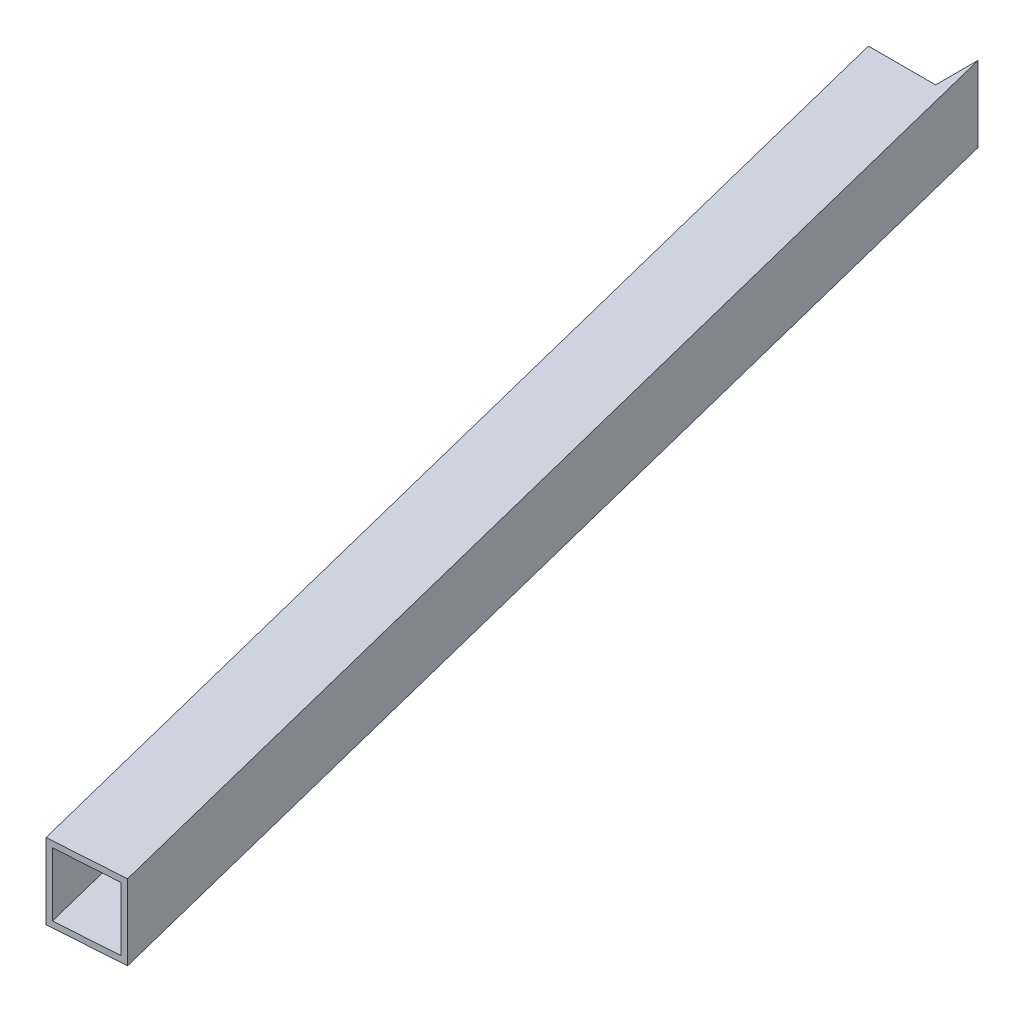
ISO-10303-21;
HEADER;
FILE_DESCRIPTION(('STEP AP214'),'2;1');
FILE_NAME('part.step','',(''),(''),'','','');
FILE_SCHEMA(('AUTOMOTIVE_DESIGN { 1 0 10303 214 1 1 1 1 }'));
ENDSEC;
DATA;
#1=APPLICATION_CONTEXT('core data for automotive mechanical design processes');
#2=APPLICATION_PROTOCOL_DEFINITION('international standard','automotive_design',2000,#1);
#3=PRODUCT_CONTEXT('',#1,'mechanical');
#4=PRODUCT('Part','Part','',(#3));
#5=PRODUCT_RELATED_PRODUCT_CATEGORY('part','',(#4));
#6=PRODUCT_DEFINITION_FORMATION('','',#4);
#7=PRODUCT_DEFINITION_CONTEXT('part definition',#1,'design');
#8=PRODUCT_DEFINITION('design','',#6,#7);
#9=PRODUCT_DEFINITION_SHAPE('','',#8);
#10=(LENGTH_UNIT() NAMED_UNIT(*) SI_UNIT(.MILLI.,.METRE.));
#11=(NAMED_UNIT(*) PLANE_ANGLE_UNIT() SI_UNIT($,.RADIAN.));
#12=(NAMED_UNIT(*) SI_UNIT($,.STERADIAN.) SOLID_ANGLE_UNIT());
#13=UNCERTAINTY_MEASURE_WITH_UNIT(LENGTH_MEASURE(1.E-05),#10,'distance_accuracy_value','');
#14=(GEOMETRIC_REPRESENTATION_CONTEXT(3) GLOBAL_UNCERTAINTY_ASSIGNED_CONTEXT((#13)) GLOBAL_UNIT_ASSIGNED_CONTEXT((#10,
#11,#12)) REPRESENTATION_CONTEXT('',''));
#15=CARTESIAN_POINT('',(0.,0.,0.));
#16=DIRECTION('',(0.,0.,1.));
#17=DIRECTION('',(1.,0.,0.));
#18=AXIS2_PLACEMENT_3D('',#15,#16,#17);
#19=CARTESIAN_POINT('',(184.701425001453,10.,-2002.42535625036));
#20=DIRECTION('',(0.,-1.,0.));
#21=DIRECTION('',(0.,0.,-1.));
#22=AXIS2_PLACEMENT_3D('',#19,#20,#21);
#23=PLANE('',#22);
#24=DIRECTION('',(0.,0.,1.));
#25=VECTOR('',#24,1.);
#26=CARTESIAN_POINT('',(185.,10.,-2300.));
#27=LINE('',#26,#25);
#28=CARTESIAN_POINT('',(185.,10.,-2001.23105625618));
#29=VERTEX_POINT('',#28);
#30=CARTESIAN_POINT('',(185.,10.,-1990.));
#31=VERTEX_POINT('',#30);
#32=EDGE_CURVE('E119',#29,#31,#27,.T.);
#33=ORIENTED_EDGE('',*,*,#32,.T.);
#34=DIRECTION('',(-1.,0.,0.));
#35=VECTOR('',#34,1.);
#36=CARTESIAN_POINT('',(175.,10.,-1990.));
#37=LINE('',#36,#35);
#38=CARTESIAN_POINT('',(167.192235935956,10.,-1990.));
#39=VERTEX_POINT('',#38);
#40=EDGE_CURVE('E126',#31,#39,#37,.T.);
#41=ORIENTED_EDGE('',*,*,#40,.T.);
#42=DIRECTION('',(0.242535625036333,0.,0.970142500145332));
#43=VECTOR('',#42,1.);
#44=CARTESIAN_POINT('',(165.298574998547,10.,-1997.57464374964));
#45=LINE('',#44,#43);
#46=CARTESIAN_POINT('',(239.858774037238,10.,-1699.33384759487));
#47=VERTEX_POINT('',#46);
#48=EDGE_CURVE('E171',#39,#47,#45,.T.);
#49=ORIENTED_EDGE('',*,*,#48,.T.);
#50=DIRECTION('',(-0.997849528858152,0.,0.0655463023942972));
#51=VECTOR('',#50,1.);
#52=CARTESIAN_POINT('',(204.762203784589,10.,-1697.02843947446));
#53=LINE('',#52,#51);
#54=CARTESIAN_POINT('',(260.141225962762,10.,-1700.66615240513));
#55=VERTEX_POINT('',#54);
#56=EDGE_CURVE('E168',#55,#47,#53,.T.);
#57=ORIENTED_EDGE('',*,*,#56,.F.);
#58=DIRECTION('',(0.242535625036333,0.,0.970142500145332));
#59=VECTOR('',#58,1.);
#60=CARTESIAN_POINT('',(184.701425001453,10.,-2002.42535625036));
#61=LINE('',#60,#59);
#62=EDGE_CURVE('E134',#29,#55,#61,.T.);
#63=ORIENTED_EDGE('',*,*,#62,.F.);
#64=EDGE_LOOP('',(#33,#41,#49,#57,#63));
#65=FACE_BOUND('',#64,.T.);
#66=ADVANCED_FACE('F41',(#65),#23,.F.);
#67=CARTESIAN_POINT('',(184.701425001453,10.,-2002.42535625036));
#68=DIRECTION('',(-0.970142500145332,0.,0.242535625036333));
#69=DIRECTION('',(0.242535625036333,0.,0.970142500145332));
#70=AXIS2_PLACEMENT_3D('',#67,#68,#69);
#71=PLANE('',#70);
#72=DIRECTION('',(0.,-1.,0.));
#73=VECTOR('',#72,1.);
#74=CARTESIAN_POINT('',(185.,10.,-2001.23105625618));
#75=LINE('',#74,#73);
#76=CARTESIAN_POINT('',(185.,-10.,-2001.23105625618));
#77=VERTEX_POINT('',#76);
#78=EDGE_CURVE('E148',#29,#77,#75,.T.);
#79=ORIENTED_EDGE('',*,*,#78,.F.);
#80=ORIENTED_EDGE('',*,*,#62,.T.);
#81=DIRECTION('',(0.,1.,0.));
#82=VECTOR('',#81,1.);
#83=CARTESIAN_POINT('',(260.141225962762,10.,-1700.66615240513));
#84=LINE('',#83,#82);
#85=CARTESIAN_POINT('',(260.141225962762,-10.,-1700.66615240513));
#86=VERTEX_POINT('',#85);
#87=EDGE_CURVE('E165',#86,#55,#84,.T.);
#88=ORIENTED_EDGE('',*,*,#87,.F.);
#89=DIRECTION('',(0.242535625036333,0.,0.970142500145332));
#90=VECTOR('',#89,1.);
#91=CARTESIAN_POINT('',(184.701425001453,-10.,-2002.42535625036));
#92=LINE('',#91,#90);
#93=EDGE_CURVE('E184',#77,#86,#92,.T.);
#94=ORIENTED_EDGE('',*,*,#93,.F.);
#95=EDGE_LOOP('',(#79,#80,#88,#94));
#96=FACE_BOUND('',#95,.T.);
#97=ADVANCED_FACE('F218',(#96),#71,.F.);
#98=CARTESIAN_POINT('',(184.701425001453,-10.,-2002.42535625036));
#99=DIRECTION('',(0.,1.,0.));
#100=DIRECTION('',(0.,0.,1.));
#101=AXIS2_PLACEMENT_3D('',#98,#99,#100);
#102=PLANE('',#101);
#103=DIRECTION('',(0.,0.,1.));
#104=VECTOR('',#103,1.);
#105=CARTESIAN_POINT('',(185.,-10.,-2300.));
#106=LINE('',#105,#104);
#107=CARTESIAN_POINT('',(185.,-10.,-1990.));
#108=VERTEX_POINT('',#107);
#109=EDGE_CURVE('E124',#77,#108,#106,.T.);
#110=ORIENTED_EDGE('',*,*,#109,.F.);
#111=ORIENTED_EDGE('',*,*,#93,.T.);
#112=DIRECTION('',(0.997849528858152,0.,-0.0655463023942972));
#113=VECTOR('',#112,1.);
#114=CARTESIAN_POINT('',(204.762203784589,-10.,-1697.02843947446));
#115=LINE('',#114,#113);
#116=CARTESIAN_POINT('',(239.858774037238,-10.,-1699.33384759487));
#117=VERTEX_POINT('',#116);
#118=EDGE_CURVE('E162',#117,#86,#115,.T.);
#119=ORIENTED_EDGE('',*,*,#118,.F.);
#120=DIRECTION('',(0.242535625036333,0.,0.970142500145332));
#121=VECTOR('',#120,1.);
#122=CARTESIAN_POINT('',(165.298574998547,-10.,-1997.57464374964));
#123=LINE('',#122,#121);
#124=CARTESIAN_POINT('',(167.192235935956,-10.,-1990.));
#125=VERTEX_POINT('',#124);
#126=EDGE_CURVE('E182',#125,#117,#123,.T.);
#127=ORIENTED_EDGE('',*,*,#126,.F.);
#128=DIRECTION('',(-1.,0.,0.));
#129=VECTOR('',#128,1.);
#130=CARTESIAN_POINT('',(175.,-10.,-1990.));
#131=LINE('',#130,#129);
#132=EDGE_CURVE('E130',#108,#125,#131,.T.);
#133=ORIENTED_EDGE('',*,*,#132,.F.);
#134=EDGE_LOOP('',(#110,#111,#119,#127,#133));
#135=FACE_BOUND('',#134,.T.);
#136=ADVANCED_FACE('F213',(#135),#102,.F.);
#137=CARTESIAN_POINT('',(165.298574998547,10.,-1997.57464374964));
#138=DIRECTION('',(0.970142500145332,0.,-0.242535625036333));
#139=DIRECTION('',(-0.242535625036333,0.,-0.970142500145332));
#140=AXIS2_PLACEMENT_3D('',#137,#138,#139);
#141=PLANE('',#140);
#142=DIRECTION('',(0.,1.,0.));
#143=VECTOR('',#142,1.);
#144=CARTESIAN_POINT('',(167.192235935956,10.,-1990.));
#145=LINE('',#144,#143);
#146=EDGE_CURVE('E55',#125,#39,#145,.T.);
#147=ORIENTED_EDGE('',*,*,#146,.F.);
#148=ORIENTED_EDGE('',*,*,#126,.T.);
#149=DIRECTION('',(0.,-1.,0.));
#150=VECTOR('',#149,1.);
#151=CARTESIAN_POINT('',(239.858774037238,10.,-1699.33384759487));
#152=LINE('',#151,#150);
#153=EDGE_CURVE('E159',#47,#117,#152,.T.);
#154=ORIENTED_EDGE('',*,*,#153,.F.);
#155=ORIENTED_EDGE('',*,*,#48,.F.);
#156=EDGE_LOOP('',(#147,#148,#154,#155));
#157=FACE_BOUND('',#156,.T.);
#158=ADVANCED_FACE('F221',(#157),#141,.F.);
#159=CARTESIAN_POINT('',(250.,0.,-1700.));
#160=DIRECTION('',(0.0655463023942972,0.,0.997849528858152));
#161=DIRECTION('',(0.997849528858152,0.,-0.0655463023942972));
#162=AXIS2_PLACEMENT_3D('',#159,#160,#161);
#163=PLANE('',#162);
#164=DIRECTION('',(0.,-1.,0.));
#165=VECTOR('',#164,1.);
#166=CARTESIAN_POINT('',(241.48137019128,8.40000000000002,-1699.44043197969));
#167=LINE('',#166,#165);
#168=CARTESIAN_POINT('',(241.48137019128,8.40000000000002,-1699.44043197969));
#169=VERTEX_POINT('',#168);
#170=CARTESIAN_POINT('',(241.48137019128,-8.39999999999999,-1699.44043197969));
#171=VERTEX_POINT('',#170);
#172=EDGE_CURVE('E156',#169,#171,#167,.T.);
#173=ORIENTED_EDGE('',*,*,#172,.F.);
#174=DIRECTION('',(-0.997849528858152,0.,0.0655463023942972));
#175=VECTOR('',#174,1.);
#176=CARTESIAN_POINT('',(203.191263646348,8.40000000000008,-1696.92524824736));
#177=LINE('',#176,#175);
#178=CARTESIAN_POINT('',(258.51862980872,8.39999999999999,-1700.55956802031));
#179=VERTEX_POINT('',#178);
#180=EDGE_CURVE('E180',#179,#169,#177,.T.);
#181=ORIENTED_EDGE('',*,*,#180,.F.);
#182=DIRECTION('',(0.,1.,0.));
#183=VECTOR('',#182,1.);
#184=CARTESIAN_POINT('',(258.51862980872,8.39999999999999,-1700.55956802031));
#185=LINE('',#184,#183);
#186=CARTESIAN_POINT('',(258.51862980872,-8.39999999999999,-1700.55956802031));
#187=VERTEX_POINT('',#186);
#188=EDGE_CURVE('E150',#187,#179,#185,.T.);
#189=ORIENTED_EDGE('',*,*,#188,.F.);
#190=DIRECTION('',(0.997849528858152,0.,-0.0655463023942972));
#191=VECTOR('',#190,1.);
#192=CARTESIAN_POINT('',(203.191263646348,-8.39999999999999,-1696.92524824736));
#193=LINE('',#192,#191);
#194=EDGE_CURVE('E153',#171,#187,#193,.T.);
#195=ORIENTED_EDGE('',*,*,#194,.F.);
#196=EDGE_LOOP('',(#173,#181,#189,#195));
#197=FACE_BOUND('',#196,.T.);
#198=ORIENTED_EDGE('',*,*,#87,.T.);
#199=ORIENTED_EDGE('',*,*,#56,.T.);
#200=ORIENTED_EDGE('',*,*,#153,.T.);
#201=ORIENTED_EDGE('',*,*,#118,.T.);
#202=EDGE_LOOP('',(#198,#199,#200,#201));
#203=FACE_BOUND('',#202,.T.);
#204=ADVANCED_FACE('F199',(#197,#203),#163,.T.);
#205=CARTESIAN_POINT('',(166.850802998779,8.40000000000002,-1997.9627007497));
#206=DIRECTION('',(0.970142500145332,0.,-0.242535625036333));
#207=DIRECTION('',(-0.242535625036333,0.,-0.970142500145332));
#208=AXIS2_PLACEMENT_3D('',#205,#206,#207);
#209=PLANE('',#208);
#210=DIRECTION('',(0.242535625036333,0.,0.970142500145332));
#211=VECTOR('',#210,1.);
#212=CARTESIAN_POINT('',(166.850802998779,-8.39999999999999,-1997.9627007497));
#213=LINE('',#212,#211);
#214=CARTESIAN_POINT('',(168.841478186203,-8.39999999999999,-1990.));
#215=VERTEX_POINT('',#214);
#216=EDGE_CURVE('E178',#215,#171,#213,.T.);
#217=ORIENTED_EDGE('',*,*,#216,.F.);
#218=DIRECTION('',(0.,1.,0.));
#219=VECTOR('',#218,1.);
#220=CARTESIAN_POINT('',(168.841478186203,8.40000000000002,-1990.));
#221=LINE('',#220,#219);
#222=CARTESIAN_POINT('',(168.841478186203,8.40000000000002,-1990.));
#223=VERTEX_POINT('',#222);
#224=EDGE_CURVE('E48',#215,#223,#221,.T.);
#225=ORIENTED_EDGE('',*,*,#224,.T.);
#226=DIRECTION('',(0.242535625036333,0.,0.970142500145332));
#227=VECTOR('',#226,1.);
#228=CARTESIAN_POINT('',(166.850802998779,8.40000000000002,-1997.9627007497));
#229=LINE('',#228,#227);
#230=EDGE_CURVE('E172',#223,#169,#229,.T.);
#231=ORIENTED_EDGE('',*,*,#230,.T.);
#232=ORIENTED_EDGE('',*,*,#172,.T.);
#233=EDGE_LOOP('',(#217,#225,#231,#232));
#234=FACE_BOUND('',#233,.T.);
#235=ADVANCED_FACE('F191',(#234),#209,.T.);
#236=CARTESIAN_POINT('',(183.149197001221,-8.39999999999999,-2002.03729925031));
#237=DIRECTION('',(0.,1.,0.));
#238=DIRECTION('',(0.,0.,1.));
#239=AXIS2_PLACEMENT_3D('',#236,#237,#238);
#240=PLANE('',#239);
#241=DIRECTION('',(0.242535625036333,0.,0.970142500145332));
#242=VECTOR('',#241,1.);
#243=CARTESIAN_POINT('',(183.149197001221,-8.39999999999999,-2002.03729925031));
#244=LINE('',#243,#242);
#245=CARTESIAN_POINT('',(185.,-8.39999999999999,-1994.63408725519));
#246=VERTEX_POINT('',#245);
#247=EDGE_CURVE('E176',#246,#187,#244,.T.);
#248=ORIENTED_EDGE('',*,*,#247,.F.);
#249=DIRECTION('',(0.,0.,1.));
#250=VECTOR('',#249,1.);
#251=CARTESIAN_POINT('',(185.,-8.39999999999999,-2002.03729925031));
#252=LINE('',#251,#250);
#253=CARTESIAN_POINT('',(185.,-8.39999999999999,-1990.));
#254=VERTEX_POINT('',#253);
#255=EDGE_CURVE('E11',#246,#254,#252,.T.);
#256=ORIENTED_EDGE('',*,*,#255,.T.);
#257=DIRECTION('',(-1.,0.,0.));
#258=VECTOR('',#257,1.);
#259=CARTESIAN_POINT('',(183.149197001221,-8.39999999999999,-1990.));
#260=LINE('',#259,#258);
#261=EDGE_CURVE('E139',#254,#215,#260,.T.);
#262=ORIENTED_EDGE('',*,*,#261,.T.);
#263=ORIENTED_EDGE('',*,*,#216,.T.);
#264=ORIENTED_EDGE('',*,*,#194,.T.);
#265=EDGE_LOOP('',(#248,#256,#262,#263,#264));
#266=FACE_BOUND('',#265,.T.);
#267=ADVANCED_FACE('F206',(#266),#240,.T.);
#268=CARTESIAN_POINT('',(183.149197001221,8.39999999999999,-2002.03729925031));
#269=DIRECTION('',(-0.970142500145332,0.,0.242535625036333));
#270=DIRECTION('',(0.242535625036333,0.,0.970142500145332));
#271=AXIS2_PLACEMENT_3D('',#268,#269,#270);
#272=PLANE('',#271);
#273=DIRECTION('',(0.242535625036333,0.,0.970142500145332));
#274=VECTOR('',#273,1.);
#275=CARTESIAN_POINT('',(183.149197001221,8.39999999999999,-2002.03729925031));
#276=LINE('',#275,#274);
#277=CARTESIAN_POINT('',(185.,8.39999999999999,-1994.63408725519));
#278=VERTEX_POINT('',#277);
#279=EDGE_CURVE('E174',#278,#179,#276,.T.);
#280=ORIENTED_EDGE('',*,*,#279,.F.);
#281=DIRECTION('',(0.,-1.,0.));
#282=VECTOR('',#281,1.);
#283=CARTESIAN_POINT('',(185.,8.39999999999999,-1994.63408725519));
#284=LINE('',#283,#282);
#285=EDGE_CURVE('E144',#278,#246,#284,.T.);
#286=ORIENTED_EDGE('',*,*,#285,.T.);
#287=ORIENTED_EDGE('',*,*,#247,.T.);
#288=ORIENTED_EDGE('',*,*,#188,.T.);
#289=EDGE_LOOP('',(#280,#286,#287,#288));
#290=FACE_BOUND('',#289,.T.);
#291=ADVANCED_FACE('F203',(#290),#272,.T.);
#292=CARTESIAN_POINT('',(183.149197001221,8.39999999999999,-2002.03729925031));
#293=DIRECTION('',(0.,-1.,0.));
#294=DIRECTION('',(1.,0.,0.));
#295=AXIS2_PLACEMENT_3D('',#292,#293,#294);
#296=PLANE('',#295);
#297=DIRECTION('',(1.,0.,0.));
#298=VECTOR('',#297,1.);
#299=CARTESIAN_POINT('',(183.149197001221,8.4,-1990.));
#300=LINE('',#299,#298);
#301=CARTESIAN_POINT('',(185.,8.40000000000028,-1990.));
#302=VERTEX_POINT('',#301);
#303=EDGE_CURVE('E62',#223,#302,#300,.T.);
#304=ORIENTED_EDGE('',*,*,#303,.T.);
#305=DIRECTION('',(0.,0.,-1.));
#306=VECTOR('',#305,1.);
#307=CARTESIAN_POINT('',(185.,8.39999999999999,-2002.03729925031));
#308=LINE('',#307,#306);
#309=EDGE_CURVE('E122',#302,#278,#308,.T.);
#310=ORIENTED_EDGE('',*,*,#309,.T.);
#311=ORIENTED_EDGE('',*,*,#279,.T.);
#312=ORIENTED_EDGE('',*,*,#180,.T.);
#313=ORIENTED_EDGE('',*,*,#230,.F.);
#314=EDGE_LOOP('',(#304,#310,#311,#312,#313));
#315=FACE_BOUND('',#314,.T.);
#316=ADVANCED_FACE('F194',(#315),#296,.T.);
#317=CARTESIAN_POINT('',(175.,-10.,-1990.));
#318=DIRECTION('',(0.,0.,-1.));
#319=DIRECTION('',(-1.,0.,0.));
#320=AXIS2_PLACEMENT_3D('',#317,#318,#319);
#321=PLANE('',#320);
#322=ORIENTED_EDGE('',*,*,#146,.T.);
#323=ORIENTED_EDGE('',*,*,#40,.F.);
#324=DIRECTION('',(0.,1.,0.));
#325=VECTOR('',#324,1.);
#326=CARTESIAN_POINT('',(185.,-10.,-1990.));
#327=LINE('',#326,#325);
#328=EDGE_CURVE('E116',#302,#31,#327,.T.);
#329=ORIENTED_EDGE('',*,*,#328,.F.);
#330=ORIENTED_EDGE('',*,*,#303,.F.);
#331=ORIENTED_EDGE('',*,*,#224,.F.);
#332=ORIENTED_EDGE('',*,*,#261,.F.);
#333=EDGE_CURVE('E123',#108,#254,#327,.T.);
#334=ORIENTED_EDGE('',*,*,#333,.F.);
#335=ORIENTED_EDGE('',*,*,#132,.T.);
#336=EDGE_LOOP('',(#322,#323,#329,#330,#331,#332,#334,#335));
#337=FACE_BOUND('',#336,.T.);
#338=ADVANCED_FACE('F127',(#337),#321,.T.);
#339=CARTESIAN_POINT('',(185.,-10.,-2300.));
#340=DIRECTION('',(-1.,0.,0.));
#341=DIRECTION('',(0.,0.,1.));
#342=AXIS2_PLACEMENT_3D('',#339,#340,#341);
#343=PLANE('',#342);
#344=ORIENTED_EDGE('',*,*,#78,.T.);
#345=ORIENTED_EDGE('',*,*,#109,.T.);
#346=ORIENTED_EDGE('',*,*,#333,.T.);
#347=ORIENTED_EDGE('',*,*,#255,.F.);
#348=ORIENTED_EDGE('',*,*,#285,.F.);
#349=ORIENTED_EDGE('',*,*,#309,.F.);
#350=ORIENTED_EDGE('',*,*,#328,.T.);
#351=ORIENTED_EDGE('',*,*,#32,.F.);
#352=EDGE_LOOP('',(#344,#345,#346,#347,#348,#349,#350,#351));
#353=FACE_BOUND('',#352,.T.);
#354=ADVANCED_FACE('F117',(#353),#343,.T.);
#355=CLOSED_SHELL('',(#66,#97,#136,#158,#204,#235,#267,#291,#316,#338,#354));
#356=MANIFOLD_SOLID_BREP('B2',#355);
#357=ADVANCED_BREP_SHAPE_REPRESENTATION('',(#18,#356),#14);
#358=SHAPE_DEFINITION_REPRESENTATION(#9,#357);
ENDSEC;
END-ISO-10303-21;
